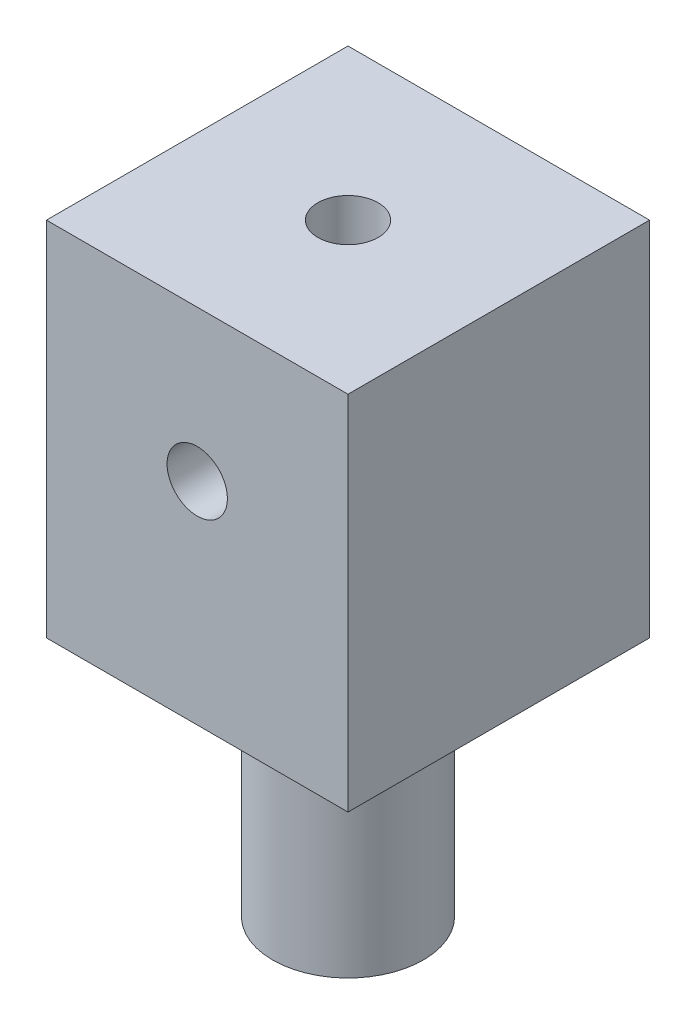
ISO-10303-21;
HEADER;
FILE_DESCRIPTION(('STEP AP214'),'2;1');
FILE_NAME('part.step','',(''),(''),'','','');
FILE_SCHEMA(('AUTOMOTIVE_DESIGN { 1 0 10303 214 1 1 1 1 }'));
ENDSEC;
DATA;
#1=APPLICATION_CONTEXT('core data for automotive mechanical design processes');
#2=APPLICATION_PROTOCOL_DEFINITION('international standard','automotive_design',2000,#1);
#3=PRODUCT_CONTEXT('',#1,'mechanical');
#4=PRODUCT('Part','Part','',(#3));
#5=PRODUCT_RELATED_PRODUCT_CATEGORY('part','',(#4));
#6=PRODUCT_DEFINITION_FORMATION('','',#4);
#7=PRODUCT_DEFINITION_CONTEXT('part definition',#1,'design');
#8=PRODUCT_DEFINITION('design','',#6,#7);
#9=PRODUCT_DEFINITION_SHAPE('','',#8);
#10=(LENGTH_UNIT() NAMED_UNIT(*) SI_UNIT(.MILLI.,.METRE.));
#11=(NAMED_UNIT(*) PLANE_ANGLE_UNIT() SI_UNIT($,.RADIAN.));
#12=(NAMED_UNIT(*) SI_UNIT($,.STERADIAN.) SOLID_ANGLE_UNIT());
#13=UNCERTAINTY_MEASURE_WITH_UNIT(LENGTH_MEASURE(1.E-05),#10,'distance_accuracy_value','');
#14=(GEOMETRIC_REPRESENTATION_CONTEXT(3) GLOBAL_UNCERTAINTY_ASSIGNED_CONTEXT((#13)) GLOBAL_UNIT_ASSIGNED_CONTEXT((#10,
#11,#12)) REPRESENTATION_CONTEXT('',''));
#15=CARTESIAN_POINT('',(0.,0.,0.));
#16=DIRECTION('',(0.,0.,1.));
#17=DIRECTION('',(1.,0.,0.));
#18=AXIS2_PLACEMENT_3D('',#15,#16,#17);
#19=CARTESIAN_POINT('',(0.,63.5,0.));
#20=DIRECTION('',(0.,-1.,0.));
#21=DIRECTION('',(0.,0.,-1.));
#22=AXIS2_PLACEMENT_3D('',#19,#20,#21);
#23=CYLINDRICAL_SURFACE('',#22,15.875);
#24=CARTESIAN_POINT('',(0.,0.,0.));
#25=DIRECTION('',(0.,1.,0.));
#26=DIRECTION('',(0.,0.,1.));
#27=AXIS2_PLACEMENT_3D('',#24,#25,#26);
#28=CIRCLE('',#27,15.875);
#29=CARTESIAN_POINT('',(0.,0.,15.875));
#30=VERTEX_POINT('',#29);
#31=EDGE_CURVE('E150',#30,#30,#28,.T.);
#32=ORIENTED_EDGE('',*,*,#31,.T.);
#33=EDGE_LOOP('',(#32));
#34=FACE_BOUND('',#33,.T.);
#35=CARTESIAN_POINT('',(0.,50.8,0.));
#36=DIRECTION('',(0.,1.,0.));
#37=DIRECTION('',(0.,0.,1.));
#38=AXIS2_PLACEMENT_3D('',#35,#36,#37);
#39=CIRCLE('',#38,15.875);
#40=CARTESIAN_POINT('',(0.,50.8,15.875));
#41=VERTEX_POINT('',#40);
#42=EDGE_CURVE('E11',#41,#41,#39,.T.);
#43=ORIENTED_EDGE('',*,*,#42,.F.);
#44=EDGE_LOOP('',(#43));
#45=FACE_BOUND('',#44,.T.);
#46=ADVANCED_FACE('F40',(#34,#45),#23,.T.);
#47=CARTESIAN_POINT('',(0.,0.,0.));
#48=DIRECTION('',(0.,1.,0.));
#49=DIRECTION('',(0.,0.,1.));
#50=AXIS2_PLACEMENT_3D('',#47,#48,#49);
#51=PLANE('',#50);
#52=ORIENTED_EDGE('',*,*,#31,.F.);
#53=EDGE_LOOP('',(#52));
#54=FACE_BOUND('',#53,.T.);
#55=ADVANCED_FACE('F167',(#54),#51,.F.);
#56=CARTESIAN_POINT('',(0.,127.,31.75));
#57=DIRECTION('',(0.,0.,-1.));
#58=DIRECTION('',(-1.,0.,0.));
#59=AXIS2_PLACEMENT_3D('',#56,#57,#58);
#60=PLANE('',#59);
#61=CARTESIAN_POINT('',(0.,95.25,31.75));
#62=DIRECTION('',(0.,0.,1.));
#63=DIRECTION('',(1.,0.,0.));
#64=AXIS2_PLACEMENT_3D('',#61,#62,#63);
#65=CIRCLE('',#64,6.35);
#66=CARTESIAN_POINT('',(6.35000000000002,95.25,31.75));
#67=VERTEX_POINT('',#66);
#68=EDGE_CURVE('E102',#67,#67,#65,.T.);
#69=ORIENTED_EDGE('',*,*,#68,.F.);
#70=EDGE_LOOP('',(#69));
#71=FACE_BOUND('',#70,.T.);
#72=DIRECTION('',(1.,0.,0.));
#73=VECTOR('',#72,1.);
#74=CARTESIAN_POINT('',(0.,50.8,31.75));
#75=LINE('',#74,#73);
#76=CARTESIAN_POINT('',(-31.75,50.8,31.75));
#77=VERTEX_POINT('',#76);
#78=CARTESIAN_POINT('',(31.75,50.8,31.75));
#79=VERTEX_POINT('',#78);
#80=EDGE_CURVE('E106',#77,#79,#75,.T.);
#81=ORIENTED_EDGE('',*,*,#80,.T.);
#82=DIRECTION('',(0.,-1.,0.));
#83=VECTOR('',#82,1.);
#84=CARTESIAN_POINT('',(31.75,127.,31.75));
#85=LINE('',#84,#83);
#86=CARTESIAN_POINT('',(31.75,127.,31.75));
#87=VERTEX_POINT('',#86);
#88=EDGE_CURVE('E147',#87,#79,#85,.T.);
#89=ORIENTED_EDGE('',*,*,#88,.F.);
#90=DIRECTION('',(1.,0.,0.));
#91=VECTOR('',#90,1.);
#92=CARTESIAN_POINT('',(0.,127.,31.75));
#93=LINE('',#92,#91);
#94=CARTESIAN_POINT('',(-31.75,127.,31.75));
#95=VERTEX_POINT('',#94);
#96=EDGE_CURVE('E113',#95,#87,#93,.T.);
#97=ORIENTED_EDGE('',*,*,#96,.F.);
#98=DIRECTION('',(0.,-1.,0.));
#99=VECTOR('',#98,1.);
#100=CARTESIAN_POINT('',(-31.75,127.,31.75));
#101=LINE('',#100,#99);
#102=EDGE_CURVE('E63',#95,#77,#101,.T.);
#103=ORIENTED_EDGE('',*,*,#102,.T.);
#104=EDGE_LOOP('',(#81,#89,#97,#103));
#105=FACE_BOUND('',#104,.T.);
#106=ADVANCED_FACE('F172',(#71,#105),#60,.F.);
#107=CARTESIAN_POINT('',(31.75,127.,0.));
#108=DIRECTION('',(-1.,0.,0.));
#109=DIRECTION('',(0.,0.,1.));
#110=AXIS2_PLACEMENT_3D('',#107,#108,#109);
#111=PLANE('',#110);
#112=DIRECTION('',(0.,0.,-1.));
#113=VECTOR('',#112,1.);
#114=CARTESIAN_POINT('',(31.75,50.8,0.));
#115=LINE('',#114,#113);
#116=CARTESIAN_POINT('',(31.75,50.8,-31.75));
#117=VERTEX_POINT('',#116);
#118=EDGE_CURVE('E128',#79,#117,#115,.T.);
#119=ORIENTED_EDGE('',*,*,#118,.T.);
#120=DIRECTION('',(0.,-1.,0.));
#121=VECTOR('',#120,1.);
#122=CARTESIAN_POINT('',(31.75,127.,-31.75));
#123=LINE('',#122,#121);
#124=CARTESIAN_POINT('',(31.75,127.,-31.75));
#125=VERTEX_POINT('',#124);
#126=EDGE_CURVE('E144',#125,#117,#123,.T.);
#127=ORIENTED_EDGE('',*,*,#126,.F.);
#128=DIRECTION('',(0.,0.,-1.));
#129=VECTOR('',#128,1.);
#130=CARTESIAN_POINT('',(31.75,127.,0.));
#131=LINE('',#130,#129);
#132=EDGE_CURVE('E90',#87,#125,#131,.T.);
#133=ORIENTED_EDGE('',*,*,#132,.F.);
#134=ORIENTED_EDGE('',*,*,#88,.T.);
#135=EDGE_LOOP('',(#119,#127,#133,#134));
#136=FACE_BOUND('',#135,.T.);
#137=ADVANCED_FACE('F189',(#136),#111,.F.);
#138=CARTESIAN_POINT('',(0.,127.,-31.75));
#139=DIRECTION('',(0.,0.,-1.));
#140=DIRECTION('',(-1.,0.,0.));
#141=AXIS2_PLACEMENT_3D('',#138,#139,#140);
#142=PLANE('',#141);
#143=DIRECTION('',(1.,0.,0.));
#144=VECTOR('',#143,1.);
#145=CARTESIAN_POINT('',(0.,50.8,-31.75));
#146=LINE('',#145,#144);
#147=CARTESIAN_POINT('',(-31.75,50.8,-31.75));
#148=VERTEX_POINT('',#147);
#149=EDGE_CURVE('E132',#148,#117,#146,.T.);
#150=ORIENTED_EDGE('',*,*,#149,.F.);
#151=DIRECTION('',(0.,-1.,0.));
#152=VECTOR('',#151,1.);
#153=CARTESIAN_POINT('',(-31.75,127.,-31.75));
#154=LINE('',#153,#152);
#155=CARTESIAN_POINT('',(-31.75,127.,-31.75));
#156=VERTEX_POINT('',#155);
#157=EDGE_CURVE('E141',#156,#148,#154,.T.);
#158=ORIENTED_EDGE('',*,*,#157,.F.);
#159=DIRECTION('',(1.,0.,0.));
#160=VECTOR('',#159,1.);
#161=CARTESIAN_POINT('',(0.,127.,-31.75));
#162=LINE('',#161,#160);
#163=EDGE_CURVE('E119',#156,#125,#162,.T.);
#164=ORIENTED_EDGE('',*,*,#163,.T.);
#165=ORIENTED_EDGE('',*,*,#126,.T.);
#166=EDGE_LOOP('',(#150,#158,#164,#165));
#167=FACE_BOUND('',#166,.T.);
#168=ADVANCED_FACE('F188',(#167),#142,.T.);
#169=CARTESIAN_POINT('',(0.,127.,0.));
#170=DIRECTION('',(0.,-1.,0.));
#171=DIRECTION('',(0.,0.,-1.));
#172=AXIS2_PLACEMENT_3D('',#169,#170,#171);
#173=CYLINDRICAL_SURFACE('',#172,6.35);
#174=CARTESIAN_POINT('',(0.,63.5,0.));
#175=DIRECTION('',(0.,1.,0.));
#176=DIRECTION('',(0.,0.,1.));
#177=AXIS2_PLACEMENT_3D('',#174,#175,#176);
#178=CIRCLE('',#177,6.35);
#179=CARTESIAN_POINT('',(0.,63.5,6.35));
#180=VERTEX_POINT('',#179);
#181=EDGE_CURVE('E48',#180,#180,#178,.F.);
#182=ORIENTED_EDGE('',*,*,#181,.T.);
#183=EDGE_LOOP('',(#182));
#184=FACE_BOUND('',#183,.T.);
#185=CARTESIAN_POINT('',(0.,95.25,0.));
#186=DIRECTION('',(0.,-0.707106781186547,0.707106781186548));
#187=DIRECTION('',(0.,0.707106781186547,0.707106781186548));
#188=AXIS2_PLACEMENT_3D('',#185,#186,#187);
#189=ELLIPSE('',#188,8.98025612106915,6.35);
#190=CARTESIAN_POINT('',(6.35000000000001,95.25,0.));
#191=VERTEX_POINT('',#190);
#192=CARTESIAN_POINT('',(-6.34999999999999,95.25,0.));
#193=VERTEX_POINT('',#192);
#194=EDGE_CURVE('E54',#191,#193,#189,.T.);
#195=ORIENTED_EDGE('',*,*,#194,.T.);
#196=CARTESIAN_POINT('',(0.,95.25,0.));
#197=DIRECTION('',(0.,0.707106781186547,0.707106781186548));
#198=DIRECTION('',(0.,-0.707106781186547,0.707106781186548));
#199=AXIS2_PLACEMENT_3D('',#196,#197,#198);
#200=ELLIPSE('',#199,8.98025612106915,6.35);
#201=EDGE_CURVE('E93',#193,#191,#200,.T.);
#202=ORIENTED_EDGE('',*,*,#201,.T.);
#203=EDGE_LOOP('',(#195,#202));
#204=FACE_BOUND('',#203,.T.);
#205=CARTESIAN_POINT('',(0.,127.,0.));
#206=DIRECTION('',(0.,1.,0.));
#207=DIRECTION('',(0.,0.,1.));
#208=AXIS2_PLACEMENT_3D('',#205,#206,#207);
#209=CIRCLE('',#208,6.35);
#210=CARTESIAN_POINT('',(0.,127.,6.35));
#211=VERTEX_POINT('',#210);
#212=EDGE_CURVE('E109',#211,#211,#209,.T.);
#213=ORIENTED_EDGE('',*,*,#212,.T.);
#214=EDGE_LOOP('',(#213));
#215=FACE_BOUND('',#214,.T.);
#216=ADVANCED_FACE('F99',(#184,#204,#215),#173,.F.);
#217=CARTESIAN_POINT('',(-31.75,127.,0.));
#218=DIRECTION('',(-1.,0.,0.));
#219=DIRECTION('',(0.,0.,1.));
#220=AXIS2_PLACEMENT_3D('',#217,#218,#219);
#221=PLANE('',#220);
#222=DIRECTION('',(0.,0.,-1.));
#223=VECTOR('',#222,1.);
#224=CARTESIAN_POINT('',(-31.75,50.8,0.));
#225=LINE('',#224,#223);
#226=EDGE_CURVE('E114',#77,#148,#225,.T.);
#227=ORIENTED_EDGE('',*,*,#226,.F.);
#228=ORIENTED_EDGE('',*,*,#102,.F.);
#229=DIRECTION('',(0.,0.,-1.));
#230=VECTOR('',#229,1.);
#231=CARTESIAN_POINT('',(-31.75,127.,0.));
#232=LINE('',#231,#230);
#233=EDGE_CURVE('E123',#95,#156,#232,.T.);
#234=ORIENTED_EDGE('',*,*,#233,.T.);
#235=ORIENTED_EDGE('',*,*,#157,.T.);
#236=EDGE_LOOP('',(#227,#228,#234,#235));
#237=FACE_BOUND('',#236,.T.);
#238=ADVANCED_FACE('F183',(#237),#221,.T.);
#239=CARTESIAN_POINT('',(0.,127.,0.));
#240=DIRECTION('',(0.,1.,0.));
#241=DIRECTION('',(0.,0.,1.));
#242=AXIS2_PLACEMENT_3D('',#239,#240,#241);
#243=PLANE('',#242);
#244=ORIENTED_EDGE('',*,*,#212,.F.);
#245=EDGE_LOOP('',(#244));
#246=FACE_BOUND('',#245,.T.);
#247=ORIENTED_EDGE('',*,*,#96,.T.);
#248=ORIENTED_EDGE('',*,*,#132,.T.);
#249=ORIENTED_EDGE('',*,*,#163,.F.);
#250=ORIENTED_EDGE('',*,*,#233,.F.);
#251=EDGE_LOOP('',(#247,#248,#249,#250));
#252=FACE_BOUND('',#251,.T.);
#253=ADVANCED_FACE('F180',(#246,#252),#243,.T.);
#254=CARTESIAN_POINT('',(0.,50.8,0.));
#255=DIRECTION('',(0.,1.,0.));
#256=DIRECTION('',(0.,0.,1.));
#257=AXIS2_PLACEMENT_3D('',#254,#255,#256);
#258=PLANE('',#257);
#259=ORIENTED_EDGE('',*,*,#42,.T.);
#260=EDGE_LOOP('',(#259));
#261=FACE_BOUND('',#260,.T.);
#262=ORIENTED_EDGE('',*,*,#80,.F.);
#263=ORIENTED_EDGE('',*,*,#226,.T.);
#264=ORIENTED_EDGE('',*,*,#149,.T.);
#265=ORIENTED_EDGE('',*,*,#118,.F.);
#266=EDGE_LOOP('',(#262,#263,#264,#265));
#267=FACE_BOUND('',#266,.T.);
#268=ADVANCED_FACE('F163',(#261,#267),#258,.F.);
#269=CARTESIAN_POINT('',(0.,95.25,-31.751));
#270=DIRECTION('',(0.,0.,1.));
#271=DIRECTION('',(1.,0.,0.));
#272=AXIS2_PLACEMENT_3D('',#269,#270,#271);
#273=CYLINDRICAL_SURFACE('',#272,6.35);
#274=ORIENTED_EDGE('',*,*,#201,.F.);
#275=ORIENTED_EDGE('',*,*,#194,.F.);
#276=EDGE_LOOP('',(#274,#275));
#277=FACE_BOUND('',#276,.T.);
#278=ORIENTED_EDGE('',*,*,#68,.T.);
#279=EDGE_LOOP('',(#278));
#280=FACE_BOUND('',#279,.T.);
#281=ADVANCED_FACE('F94',(#277,#280),#273,.F.);
#282=CARTESIAN_POINT('',(0.,63.5,0.));
#283=DIRECTION('',(0.,1.,0.));
#284=DIRECTION('',(0.,0.,1.));
#285=AXIS2_PLACEMENT_3D('',#282,#283,#284);
#286=PLANE('',#285);
#287=ORIENTED_EDGE('',*,*,#181,.F.);
#288=EDGE_LOOP('',(#287));
#289=FACE_BOUND('',#288,.T.);
#290=ADVANCED_FACE('F158',(#289),#286,.T.);
#291=CLOSED_SHELL('',(#46,#55,#106,#137,#168,#216,#238,#253,#268,#281,#290));
#292=MANIFOLD_SOLID_BREP('B2',#291);
#293=ADVANCED_BREP_SHAPE_REPRESENTATION('',(#18,#292),#14);
#294=SHAPE_DEFINITION_REPRESENTATION(#9,#293);
ENDSEC;
END-ISO-10303-21;
